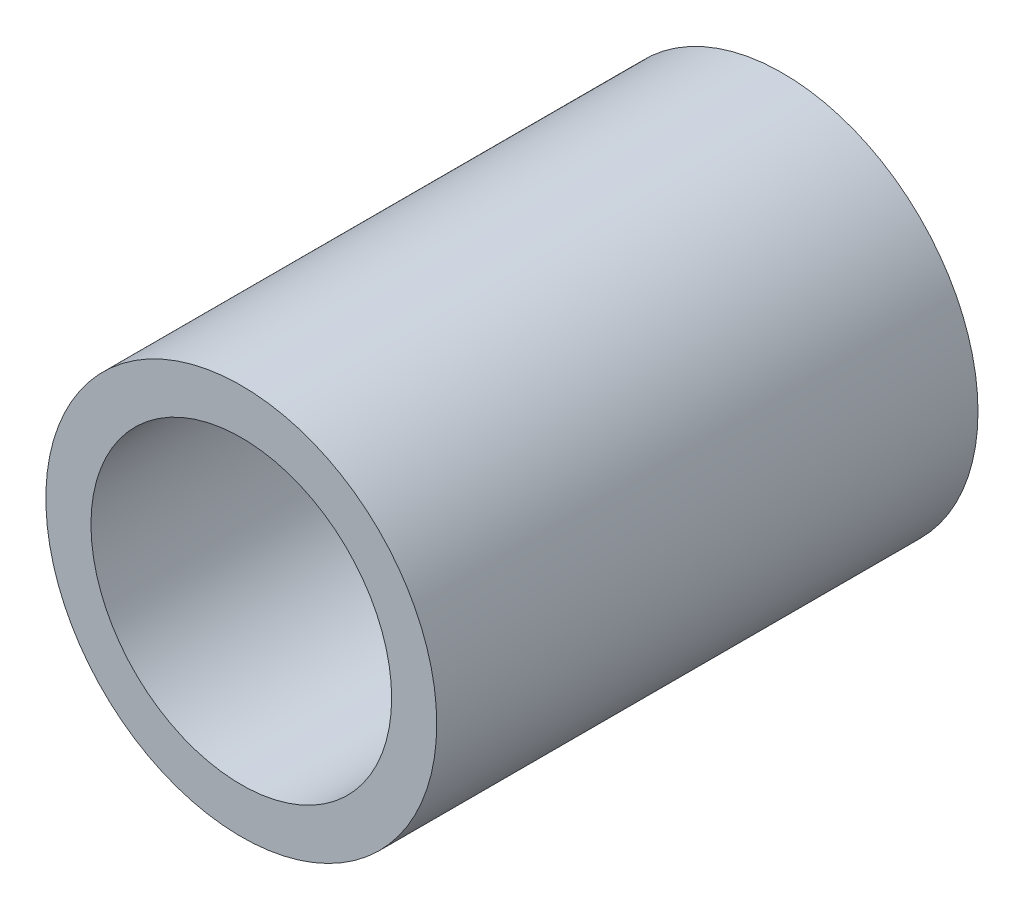
ISO-10303-21;
HEADER;
FILE_DESCRIPTION(('STEP AP214'),'2;1');
FILE_NAME('part.step','',(''),(''),'','','');
FILE_SCHEMA(('AUTOMOTIVE_DESIGN { 1 0 10303 214 1 1 1 1 }'));
ENDSEC;
DATA;
#1=APPLICATION_CONTEXT('core data for automotive mechanical design processes');
#2=APPLICATION_PROTOCOL_DEFINITION('international standard','automotive_design',2000,#1);
#3=PRODUCT_CONTEXT('',#1,'mechanical');
#4=PRODUCT('Part','Part','',(#3));
#5=PRODUCT_RELATED_PRODUCT_CATEGORY('part','',(#4));
#6=PRODUCT_DEFINITION_FORMATION('','',#4);
#7=PRODUCT_DEFINITION_CONTEXT('part definition',#1,'design');
#8=PRODUCT_DEFINITION('design','',#6,#7);
#9=PRODUCT_DEFINITION_SHAPE('','',#8);
#10=(LENGTH_UNIT() NAMED_UNIT(*) SI_UNIT(.MILLI.,.METRE.));
#11=(NAMED_UNIT(*) PLANE_ANGLE_UNIT() SI_UNIT($,.RADIAN.));
#12=(NAMED_UNIT(*) SI_UNIT($,.STERADIAN.) SOLID_ANGLE_UNIT());
#13=UNCERTAINTY_MEASURE_WITH_UNIT(LENGTH_MEASURE(1.E-05),#10,'distance_accuracy_value','');
#14=(GEOMETRIC_REPRESENTATION_CONTEXT(3) GLOBAL_UNCERTAINTY_ASSIGNED_CONTEXT((#13)) GLOBAL_UNIT_ASSIGNED_CONTEXT((#10,
#11,#12)) REPRESENTATION_CONTEXT('',''));
#15=CARTESIAN_POINT('',(0.,0.,0.));
#16=DIRECTION('',(0.,0.,1.));
#17=DIRECTION('',(1.,0.,0.));
#18=AXIS2_PLACEMENT_3D('',#15,#16,#17);
#19=CARTESIAN_POINT('',(0.,0.,9.));
#20=DIRECTION('',(0.,0.,1.));
#21=DIRECTION('',(1.,0.,0.));
#22=AXIS2_PLACEMENT_3D('',#19,#20,#21);
#23=PLANE('',#22);
#24=CARTESIAN_POINT('',(0.,0.,9.));
#25=DIRECTION('',(0.,0.,1.));
#26=DIRECTION('',(1.,0.,0.));
#27=AXIS2_PLACEMENT_3D('',#24,#25,#26);
#28=CIRCLE('',#27,3.25);
#29=CARTESIAN_POINT('',(3.25,0.,9.));
#30=VERTEX_POINT('',#29);
#31=EDGE_CURVE('E10',#30,#30,#28,.T.);
#32=ORIENTED_EDGE('',*,*,#31,.T.);
#33=EDGE_LOOP('',(#32));
#34=FACE_BOUND('',#33,.T.);
#35=CARTESIAN_POINT('',(0.,0.,9.));
#36=DIRECTION('',(0.,0.,1.));
#37=DIRECTION('',(1.,0.,0.));
#38=AXIS2_PLACEMENT_3D('',#35,#36,#37);
#39=CIRCLE('',#38,2.5);
#40=CARTESIAN_POINT('',(2.5,0.,9.));
#41=VERTEX_POINT('',#40);
#42=EDGE_CURVE('E45',#41,#41,#39,.T.);
#43=ORIENTED_EDGE('',*,*,#42,.F.);
#44=EDGE_LOOP('',(#43));
#45=FACE_BOUND('',#44,.T.);
#46=ADVANCED_FACE('F34',(#34,#45),#23,.T.);
#47=CARTESIAN_POINT('',(0.,0.,0.));
#48=DIRECTION('',(0.,0.,1.));
#49=DIRECTION('',(1.,0.,0.));
#50=AXIS2_PLACEMENT_3D('',#47,#48,#49);
#51=PLANE('',#50);
#52=CARTESIAN_POINT('',(0.,0.,0.));
#53=DIRECTION('',(0.,0.,1.));
#54=DIRECTION('',(1.,0.,0.));
#55=AXIS2_PLACEMENT_3D('',#52,#53,#54);
#56=CIRCLE('',#55,3.25);
#57=CARTESIAN_POINT('',(3.25,0.,0.));
#58=VERTEX_POINT('',#57);
#59=EDGE_CURVE('E41',#58,#58,#56,.T.);
#60=ORIENTED_EDGE('',*,*,#59,.F.);
#61=EDGE_LOOP('',(#60));
#62=FACE_BOUND('',#61,.T.);
#63=CARTESIAN_POINT('',(0.,0.,0.));
#64=DIRECTION('',(0.,0.,1.));
#65=DIRECTION('',(1.,0.,0.));
#66=AXIS2_PLACEMENT_3D('',#63,#64,#65);
#67=CIRCLE('',#66,2.5);
#68=CARTESIAN_POINT('',(2.5,0.,0.));
#69=VERTEX_POINT('',#68);
#70=EDGE_CURVE('E49',#69,#69,#67,.T.);
#71=ORIENTED_EDGE('',*,*,#70,.T.);
#72=EDGE_LOOP('',(#71));
#73=FACE_BOUND('',#72,.T.);
#74=ADVANCED_FACE('F55',(#62,#73),#51,.F.);
#75=CARTESIAN_POINT('',(0.,0.,9.));
#76=DIRECTION('',(0.,0.,-1.));
#77=DIRECTION('',(-1.,0.,0.));
#78=AXIS2_PLACEMENT_3D('',#75,#76,#77);
#79=CYLINDRICAL_SURFACE('',#78,3.25);
#80=ORIENTED_EDGE('',*,*,#31,.F.);
#81=EDGE_LOOP('',(#80));
#82=FACE_BOUND('',#81,.T.);
#83=ORIENTED_EDGE('',*,*,#59,.T.);
#84=EDGE_LOOP('',(#83));
#85=FACE_BOUND('',#84,.T.);
#86=ADVANCED_FACE('F36',(#82,#85),#79,.T.);
#87=CARTESIAN_POINT('',(0.,0.,9.));
#88=DIRECTION('',(0.,0.,-1.));
#89=DIRECTION('',(-1.,0.,0.));
#90=AXIS2_PLACEMENT_3D('',#87,#88,#89);
#91=CYLINDRICAL_SURFACE('',#90,2.5);
#92=ORIENTED_EDGE('',*,*,#42,.T.);
#93=EDGE_LOOP('',(#92));
#94=FACE_BOUND('',#93,.T.);
#95=ORIENTED_EDGE('',*,*,#70,.F.);
#96=EDGE_LOOP('',(#95));
#97=FACE_BOUND('',#96,.T.);
#98=ADVANCED_FACE('F57',(#94,#97),#91,.F.);
#99=CLOSED_SHELL('',(#46,#74,#86,#98));
#100=MANIFOLD_SOLID_BREP('B2',#99);
#101=ADVANCED_BREP_SHAPE_REPRESENTATION('',(#18,#100),#14);
#102=SHAPE_DEFINITION_REPRESENTATION(#9,#101);
ENDSEC;
END-ISO-10303-21;
